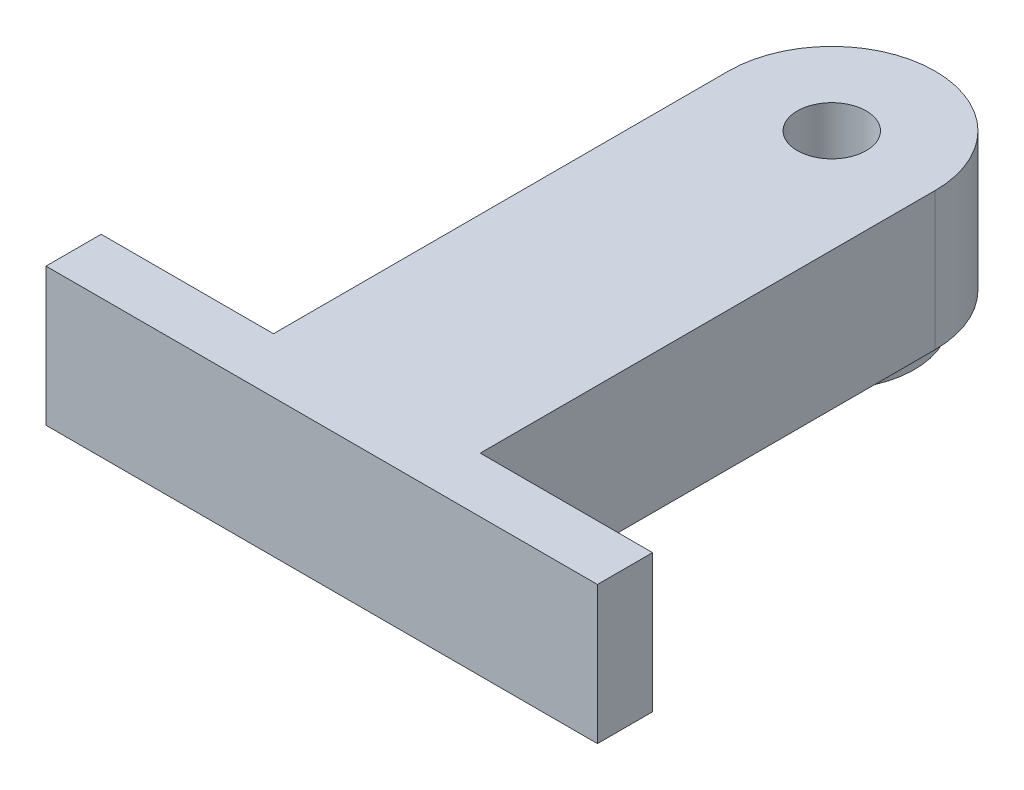
ISO-10303-21;
HEADER;
FILE_DESCRIPTION(('STEP AP214'),'2;1');
FILE_NAME('part.step','',(''),(''),'','','');
FILE_SCHEMA(('AUTOMOTIVE_DESIGN { 1 0 10303 214 1 1 1 1 }'));
ENDSEC;
DATA;
#1=APPLICATION_CONTEXT('core data for automotive mechanical design processes');
#2=APPLICATION_PROTOCOL_DEFINITION('international standard','automotive_design',2000,#1);
#3=PRODUCT_CONTEXT('',#1,'mechanical');
#4=PRODUCT('Part','Part','',(#3));
#5=PRODUCT_RELATED_PRODUCT_CATEGORY('part','',(#4));
#6=PRODUCT_DEFINITION_FORMATION('','',#4);
#7=PRODUCT_DEFINITION_CONTEXT('part definition',#1,'design');
#8=PRODUCT_DEFINITION('design','',#6,#7);
#9=PRODUCT_DEFINITION_SHAPE('','',#8);
#10=(LENGTH_UNIT() NAMED_UNIT(*) SI_UNIT(.MILLI.,.METRE.));
#11=(NAMED_UNIT(*) PLANE_ANGLE_UNIT() SI_UNIT($,.RADIAN.));
#12=(NAMED_UNIT(*) SI_UNIT($,.STERADIAN.) SOLID_ANGLE_UNIT());
#13=UNCERTAINTY_MEASURE_WITH_UNIT(LENGTH_MEASURE(1.E-05),#10,'distance_accuracy_value','');
#14=(GEOMETRIC_REPRESENTATION_CONTEXT(3) GLOBAL_UNCERTAINTY_ASSIGNED_CONTEXT((#13)) GLOBAL_UNIT_ASSIGNED_CONTEXT((#10,
#11,#12)) REPRESENTATION_CONTEXT('',''));
#15=CARTESIAN_POINT('',(0.,0.,0.));
#16=DIRECTION('',(0.,0.,1.));
#17=DIRECTION('',(1.,0.,0.));
#18=AXIS2_PLACEMENT_3D('',#15,#16,#17);
#19=CARTESIAN_POINT('',(-200.,100.,-370.));
#20=DIRECTION('',(0.,-1.,0.));
#21=DIRECTION('',(0.,0.,-1.));
#22=AXIS2_PLACEMENT_3D('',#19,#20,#21);
#23=CYLINDRICAL_SURFACE('',#22,75.);
#24=CARTESIAN_POINT('',(-200.,0.,-370.));
#25=DIRECTION('',(0.,1.,0.));
#26=DIRECTION('',(0.,0.,1.));
#27=AXIS2_PLACEMENT_3D('',#24,#25,#26);
#28=CIRCLE('',#27,75.);
#29=CARTESIAN_POINT('',(-125.,0.,-370.));
#30=VERTEX_POINT('',#29);
#31=CARTESIAN_POINT('',(-275.,0.,-370.));
#32=VERTEX_POINT('',#31);
#33=EDGE_CURVE('E151',#30,#32,#28,.T.);
#34=ORIENTED_EDGE('',*,*,#33,.T.);
#35=DIRECTION('',(0.,-1.,0.));
#36=VECTOR('',#35,1.);
#37=CARTESIAN_POINT('',(-275.,100.,-370.));
#38=LINE('',#37,#36);
#39=CARTESIAN_POINT('',(-275.,100.,-370.));
#40=VERTEX_POINT('',#39);
#41=EDGE_CURVE('E42',#40,#32,#38,.T.);
#42=ORIENTED_EDGE('',*,*,#41,.F.);
#43=CARTESIAN_POINT('',(-200.,100.,-370.));
#44=DIRECTION('',(0.,1.,0.));
#45=DIRECTION('',(0.,0.,1.));
#46=AXIS2_PLACEMENT_3D('',#43,#44,#45);
#47=CIRCLE('',#46,75.);
#48=CARTESIAN_POINT('',(-125.,100.,-370.));
#49=VERTEX_POINT('',#48);
#50=EDGE_CURVE('E142',#49,#40,#47,.T.);
#51=ORIENTED_EDGE('',*,*,#50,.F.);
#52=DIRECTION('',(0.,-1.,0.));
#53=VECTOR('',#52,1.);
#54=CARTESIAN_POINT('',(-125.,100.,-370.));
#55=LINE('',#54,#53);
#56=EDGE_CURVE('E134',#49,#30,#55,.T.);
#57=ORIENTED_EDGE('',*,*,#56,.T.);
#58=EDGE_LOOP('',(#34,#42,#51,#57));
#59=FACE_BOUND('',#58,.T.);
#60=ADVANCED_FACE('F38',(#59),#23,.T.);
#61=CARTESIAN_POINT('',(-275.,100.,0.));
#62=DIRECTION('',(1.,0.,0.));
#63=DIRECTION('',(0.,0.,-1.));
#64=AXIS2_PLACEMENT_3D('',#61,#62,#63);
#65=PLANE('',#64);
#66=DIRECTION('',(0.,0.,1.));
#67=VECTOR('',#66,1.);
#68=CARTESIAN_POINT('',(-275.,0.,0.));
#69=LINE('',#68,#67);
#70=CARTESIAN_POINT('',(-275.,0.,-40.));
#71=VERTEX_POINT('',#70);
#72=EDGE_CURVE('E310',#32,#71,#69,.T.);
#73=ORIENTED_EDGE('',*,*,#72,.T.);
#74=DIRECTION('',(0.,-1.,0.));
#75=VECTOR('',#74,1.);
#76=CARTESIAN_POINT('',(-275.,100.,-40.));
#77=LINE('',#76,#75);
#78=CARTESIAN_POINT('',(-275.,100.,-40.));
#79=VERTEX_POINT('',#78);
#80=EDGE_CURVE('E307',#79,#71,#77,.T.);
#81=ORIENTED_EDGE('',*,*,#80,.F.);
#82=DIRECTION('',(0.,0.,1.));
#83=VECTOR('',#82,1.);
#84=CARTESIAN_POINT('',(-275.,100.,0.));
#85=LINE('',#84,#83);
#86=EDGE_CURVE('E100',#40,#79,#85,.T.);
#87=ORIENTED_EDGE('',*,*,#86,.F.);
#88=ORIENTED_EDGE('',*,*,#41,.T.);
#89=EDGE_LOOP('',(#73,#81,#87,#88));
#90=FACE_BOUND('',#89,.T.);
#91=ADVANCED_FACE('F172',(#90),#65,.F.);
#92=CARTESIAN_POINT('',(0.,100.,-40.));
#93=DIRECTION('',(0.,0.,1.));
#94=DIRECTION('',(1.,0.,0.));
#95=AXIS2_PLACEMENT_3D('',#92,#93,#94);
#96=PLANE('',#95);
#97=DIRECTION('',(-1.,0.,0.));
#98=VECTOR('',#97,1.);
#99=CARTESIAN_POINT('',(0.,0.,-40.));
#100=LINE('',#99,#98);
#101=CARTESIAN_POINT('',(-400.,0.,-40.));
#102=VERTEX_POINT('',#101);
#103=EDGE_CURVE('E304',#71,#102,#100,.T.);
#104=ORIENTED_EDGE('',*,*,#103,.T.);
#105=DIRECTION('',(0.,-1.,0.));
#106=VECTOR('',#105,1.);
#107=CARTESIAN_POINT('',(-400.,100.,-40.));
#108=LINE('',#107,#106);
#109=CARTESIAN_POINT('',(-400.,100.,-40.));
#110=VERTEX_POINT('',#109);
#111=EDGE_CURVE('E306',#110,#102,#108,.T.);
#112=ORIENTED_EDGE('',*,*,#111,.F.);
#113=DIRECTION('',(-1.,0.,0.));
#114=VECTOR('',#113,1.);
#115=CARTESIAN_POINT('',(0.,100.,-40.));
#116=LINE('',#115,#114);
#117=EDGE_CURVE('E133',#79,#110,#116,.T.);
#118=ORIENTED_EDGE('',*,*,#117,.F.);
#119=ORIENTED_EDGE('',*,*,#80,.T.);
#120=EDGE_LOOP('',(#104,#112,#118,#119));
#121=FACE_BOUND('',#120,.T.);
#122=ADVANCED_FACE('F177',(#121),#96,.F.);
#123=CARTESIAN_POINT('',(-400.,100.,0.));
#124=DIRECTION('',(-1.,0.,0.));
#125=DIRECTION('',(0.,0.,1.));
#126=AXIS2_PLACEMENT_3D('',#123,#124,#125);
#127=PLANE('',#126);
#128=DIRECTION('',(0.,0.,-1.));
#129=VECTOR('',#128,1.);
#130=CARTESIAN_POINT('',(-400.,0.,0.));
#131=LINE('',#130,#129);
#132=CARTESIAN_POINT('',(-400.,0.,0.));
#133=VERTEX_POINT('',#132);
#134=EDGE_CURVE('E309',#133,#102,#131,.T.);
#135=ORIENTED_EDGE('',*,*,#134,.F.);
#136=DIRECTION('',(0.,-1.,0.));
#137=VECTOR('',#136,1.);
#138=CARTESIAN_POINT('',(-400.,100.,0.));
#139=LINE('',#138,#137);
#140=CARTESIAN_POINT('',(-400.,100.,0.));
#141=VERTEX_POINT('',#140);
#142=EDGE_CURVE('E326',#141,#133,#139,.T.);
#143=ORIENTED_EDGE('',*,*,#142,.F.);
#144=DIRECTION('',(0.,0.,-1.));
#145=VECTOR('',#144,1.);
#146=CARTESIAN_POINT('',(-400.,100.,0.));
#147=LINE('',#146,#145);
#148=EDGE_CURVE('E138',#141,#110,#147,.T.);
#149=ORIENTED_EDGE('',*,*,#148,.T.);
#150=ORIENTED_EDGE('',*,*,#111,.T.);
#151=EDGE_LOOP('',(#135,#143,#149,#150));
#152=FACE_BOUND('',#151,.T.);
#153=ADVANCED_FACE('F181',(#152),#127,.T.);
#154=CARTESIAN_POINT('',(0.,100.,0.));
#155=DIRECTION('',(0.,0.,1.));
#156=DIRECTION('',(1.,0.,0.));
#157=AXIS2_PLACEMENT_3D('',#154,#155,#156);
#158=PLANE('',#157);
#159=DIRECTION('',(-1.,0.,0.));
#160=VECTOR('',#159,1.);
#161=CARTESIAN_POINT('',(0.,0.,0.));
#162=LINE('',#161,#160);
#163=CARTESIAN_POINT('',(0.,0.,0.));
#164=VERTEX_POINT('',#163);
#165=EDGE_CURVE('E316',#164,#133,#162,.T.);
#166=ORIENTED_EDGE('',*,*,#165,.F.);
#167=DIRECTION('',(0.,-1.,0.));
#168=VECTOR('',#167,1.);
#169=CARTESIAN_POINT('',(0.,100.,0.));
#170=LINE('',#169,#168);
#171=CARTESIAN_POINT('',(0.,100.,0.));
#172=VERTEX_POINT('',#171);
#173=EDGE_CURVE('E128',#172,#164,#170,.T.);
#174=ORIENTED_EDGE('',*,*,#173,.F.);
#175=DIRECTION('',(-1.,0.,0.));
#176=VECTOR('',#175,1.);
#177=CARTESIAN_POINT('',(0.,100.,0.));
#178=LINE('',#177,#176);
#179=EDGE_CURVE('E121',#172,#141,#178,.T.);
#180=ORIENTED_EDGE('',*,*,#179,.T.);
#181=ORIENTED_EDGE('',*,*,#142,.T.);
#182=EDGE_LOOP('',(#166,#174,#180,#181));
#183=FACE_BOUND('',#182,.T.);
#184=ADVANCED_FACE('F184',(#183),#158,.T.);
#185=CARTESIAN_POINT('',(0.,100.,0.));
#186=DIRECTION('',(-1.,0.,0.));
#187=DIRECTION('',(0.,0.,1.));
#188=AXIS2_PLACEMENT_3D('',#185,#186,#187);
#189=PLANE('',#188);
#190=DIRECTION('',(0.,0.,-1.));
#191=VECTOR('',#190,1.);
#192=CARTESIAN_POINT('',(0.,0.,0.));
#193=LINE('',#192,#191);
#194=CARTESIAN_POINT('',(0.,0.,-40.));
#195=VERTEX_POINT('',#194);
#196=EDGE_CURVE('E127',#164,#195,#193,.T.);
#197=ORIENTED_EDGE('',*,*,#196,.T.);
#198=DIRECTION('',(0.,-1.,0.));
#199=VECTOR('',#198,1.);
#200=CARTESIAN_POINT('',(0.,100.,-40.));
#201=LINE('',#200,#199);
#202=CARTESIAN_POINT('',(0.,100.,-40.));
#203=VERTEX_POINT('',#202);
#204=EDGE_CURVE('E124',#203,#195,#201,.T.);
#205=ORIENTED_EDGE('',*,*,#204,.F.);
#206=DIRECTION('',(0.,0.,-1.));
#207=VECTOR('',#206,1.);
#208=CARTESIAN_POINT('',(0.,100.,0.));
#209=LINE('',#208,#207);
#210=EDGE_CURVE('E114',#172,#203,#209,.T.);
#211=ORIENTED_EDGE('',*,*,#210,.F.);
#212=ORIENTED_EDGE('',*,*,#173,.T.);
#213=EDGE_LOOP('',(#197,#205,#211,#212));
#214=FACE_BOUND('',#213,.T.);
#215=ADVANCED_FACE('F125',(#214),#189,.F.);
#216=CARTESIAN_POINT('',(-125.,0.,-40.));
#217=VERTEX_POINT('',#216);
#218=EDGE_CURVE('E85',#195,#217,#100,.T.);
#219=ORIENTED_EDGE('',*,*,#218,.T.);
#220=DIRECTION('',(0.,-1.,0.));
#221=VECTOR('',#220,1.);
#222=CARTESIAN_POINT('',(-125.,100.,-40.));
#223=LINE('',#222,#221);
#224=CARTESIAN_POINT('',(-125.,100.,-40.));
#225=VERTEX_POINT('',#224);
#226=EDGE_CURVE('E129',#225,#217,#223,.T.);
#227=ORIENTED_EDGE('',*,*,#226,.F.);
#228=EDGE_CURVE('E118',#203,#225,#116,.T.);
#229=ORIENTED_EDGE('',*,*,#228,.F.);
#230=ORIENTED_EDGE('',*,*,#204,.T.);
#231=EDGE_LOOP('',(#219,#227,#229,#230));
#232=FACE_BOUND('',#231,.T.);
#233=ADVANCED_FACE('F131',(#232),#96,.F.);
#234=CARTESIAN_POINT('',(-200.,100.,-370.));
#235=DIRECTION('',(0.,-1.,0.));
#236=DIRECTION('',(0.,0.,-1.));
#237=AXIS2_PLACEMENT_3D('',#234,#235,#236);
#238=CYLINDRICAL_SURFACE('',#237,25.);
#239=CARTESIAN_POINT('',(-200.,100.,-370.));
#240=DIRECTION('',(0.,1.,0.));
#241=DIRECTION('',(0.,0.,1.));
#242=AXIS2_PLACEMENT_3D('',#239,#240,#241);
#243=CIRCLE('',#242,25.);
#244=CARTESIAN_POINT('',(-200.,100.,-345.));
#245=VERTEX_POINT('',#244);
#246=EDGE_CURVE('E143',#245,#245,#243,.T.);
#247=ORIENTED_EDGE('',*,*,#246,.T.);
#248=EDGE_LOOP('',(#247));
#249=FACE_BOUND('',#248,.T.);
#250=CARTESIAN_POINT('',(-200.,-20.,-370.));
#251=DIRECTION('',(0.,-1.,0.));
#252=DIRECTION('',(0.,0.,-1.));
#253=AXIS2_PLACEMENT_3D('',#250,#251,#252);
#254=CIRCLE('',#253,25.);
#255=CARTESIAN_POINT('',(-200.,-20.,-395.));
#256=VERTEX_POINT('',#255);
#257=EDGE_CURVE('E152',#256,#256,#254,.T.);
#258=ORIENTED_EDGE('',*,*,#257,.T.);
#259=EDGE_LOOP('',(#258));
#260=FACE_BOUND('',#259,.T.);
#261=ADVANCED_FACE('F40',(#249,#260),#238,.F.);
#262=CARTESIAN_POINT('',(-125.,100.,0.));
#263=DIRECTION('',(-1.,0.,0.));
#264=DIRECTION('',(0.,0.,1.));
#265=AXIS2_PLACEMENT_3D('',#262,#263,#264);
#266=PLANE('',#265);
#267=DIRECTION('',(0.,0.,-1.));
#268=VECTOR('',#267,1.);
#269=CARTESIAN_POINT('',(-125.,0.,0.));
#270=LINE('',#269,#268);
#271=EDGE_CURVE('E91',#217,#30,#270,.T.);
#272=ORIENTED_EDGE('',*,*,#271,.T.);
#273=ORIENTED_EDGE('',*,*,#56,.F.);
#274=DIRECTION('',(0.,0.,-1.));
#275=VECTOR('',#274,1.);
#276=CARTESIAN_POINT('',(-125.,100.,0.));
#277=LINE('',#276,#275);
#278=EDGE_CURVE('E56',#225,#49,#277,.T.);
#279=ORIENTED_EDGE('',*,*,#278,.F.);
#280=ORIENTED_EDGE('',*,*,#226,.T.);
#281=EDGE_LOOP('',(#272,#273,#279,#280));
#282=FACE_BOUND('',#281,.T.);
#283=ADVANCED_FACE('F193',(#282),#266,.F.);
#284=CARTESIAN_POINT('',(0.,100.,0.));
#285=DIRECTION('',(0.,1.,0.));
#286=DIRECTION('',(0.,0.,1.));
#287=AXIS2_PLACEMENT_3D('',#284,#285,#286);
#288=PLANE('',#287);
#289=ORIENTED_EDGE('',*,*,#246,.F.);
#290=EDGE_LOOP('',(#289));
#291=FACE_BOUND('',#290,.T.);
#292=ORIENTED_EDGE('',*,*,#50,.T.);
#293=ORIENTED_EDGE('',*,*,#86,.T.);
#294=ORIENTED_EDGE('',*,*,#117,.T.);
#295=ORIENTED_EDGE('',*,*,#148,.F.);
#296=ORIENTED_EDGE('',*,*,#179,.F.);
#297=ORIENTED_EDGE('',*,*,#210,.T.);
#298=ORIENTED_EDGE('',*,*,#228,.T.);
#299=ORIENTED_EDGE('',*,*,#278,.T.);
#300=EDGE_LOOP('',(#292,#293,#294,#295,#296,#297,#298,#299));
#301=FACE_BOUND('',#300,.T.);
#302=ADVANCED_FACE('F116',(#291,#301),#288,.T.);
#303=CARTESIAN_POINT('',(0.,0.,0.));
#304=DIRECTION('',(0.,1.,0.));
#305=DIRECTION('',(0.,0.,1.));
#306=AXIS2_PLACEMENT_3D('',#303,#304,#305);
#307=PLANE('',#306);
#308=CARTESIAN_POINT('',(-200.,0.,-370.));
#309=DIRECTION('',(0.,-1.,0.));
#310=DIRECTION('',(0.,0.,-1.));
#311=AXIS2_PLACEMENT_3D('',#308,#309,#310);
#312=CIRCLE('',#311,60.);
#313=CARTESIAN_POINT('',(-200.,0.,-430.));
#314=VERTEX_POINT('',#313);
#315=EDGE_CURVE('E11',#314,#314,#312,.T.);
#316=ORIENTED_EDGE('',*,*,#315,.F.);
#317=EDGE_LOOP('',(#316));
#318=FACE_BOUND('',#317,.T.);
#319=ORIENTED_EDGE('',*,*,#33,.F.);
#320=ORIENTED_EDGE('',*,*,#271,.F.);
#321=ORIENTED_EDGE('',*,*,#218,.F.);
#322=ORIENTED_EDGE('',*,*,#196,.F.);
#323=ORIENTED_EDGE('',*,*,#165,.T.);
#324=ORIENTED_EDGE('',*,*,#134,.T.);
#325=ORIENTED_EDGE('',*,*,#103,.F.);
#326=ORIENTED_EDGE('',*,*,#72,.F.);
#327=EDGE_LOOP('',(#319,#320,#321,#322,#323,#324,#325,#326));
#328=FACE_BOUND('',#327,.T.);
#329=ADVANCED_FACE('F160',(#318,#328),#307,.F.);
#330=CARTESIAN_POINT('',(-200.,-20.,-370.));
#331=DIRECTION('',(0.,-1.,0.));
#332=DIRECTION('',(0.,0.,-1.));
#333=AXIS2_PLACEMENT_3D('',#330,#331,#332);
#334=PLANE('',#333);
#335=CARTESIAN_POINT('',(-200.,-20.,-370.));
#336=DIRECTION('',(0.,-1.,0.));
#337=DIRECTION('',(0.,0.,-1.));
#338=AXIS2_PLACEMENT_3D('',#335,#336,#337);
#339=CIRCLE('',#338,60.);
#340=CARTESIAN_POINT('',(-200.,-20.,-430.));
#341=VERTEX_POINT('',#340);
#342=EDGE_CURVE('E148',#341,#341,#339,.T.);
#343=ORIENTED_EDGE('',*,*,#342,.T.);
#344=EDGE_LOOP('',(#343));
#345=FACE_BOUND('',#344,.T.);
#346=ORIENTED_EDGE('',*,*,#257,.F.);
#347=EDGE_LOOP('',(#346));
#348=FACE_BOUND('',#347,.T.);
#349=ADVANCED_FACE('F157',(#345,#348),#334,.T.);
#350=CARTESIAN_POINT('',(-200.,-20.,-370.));
#351=DIRECTION('',(0.,1.,0.));
#352=DIRECTION('',(0.,0.,1.));
#353=AXIS2_PLACEMENT_3D('',#350,#351,#352);
#354=CYLINDRICAL_SURFACE('',#353,60.);
#355=ORIENTED_EDGE('',*,*,#342,.F.);
#356=EDGE_LOOP('',(#355));
#357=FACE_BOUND('',#356,.T.);
#358=ORIENTED_EDGE('',*,*,#315,.T.);
#359=EDGE_LOOP('',(#358));
#360=FACE_BOUND('',#359,.T.);
#361=ADVANCED_FACE('F159',(#357,#360),#354,.T.);
#362=CLOSED_SHELL('',(#60,#91,#122,#153,#184,#215,#233,#261,#283,#302,#329,#349,#361));
#363=MANIFOLD_SOLID_BREP('B2',#362);
#364=ADVANCED_BREP_SHAPE_REPRESENTATION('',(#18,#363),#14);
#365=SHAPE_DEFINITION_REPRESENTATION(#9,#364);
ENDSEC;
END-ISO-10303-21;
